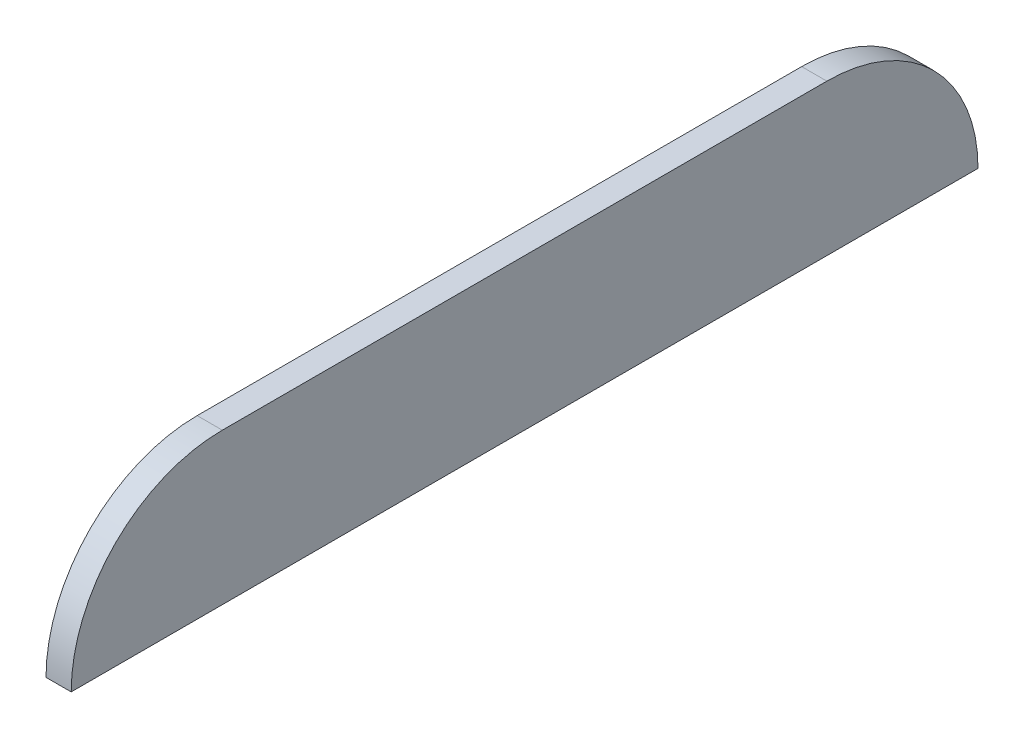
ISO-10303-21;
HEADER;
FILE_DESCRIPTION(('STEP AP214'),'2;1');
FILE_NAME('part.step','',(''),(''),'','','');
FILE_SCHEMA(('AUTOMOTIVE_DESIGN { 1 0 10303 214 1 1 1 1 }'));
ENDSEC;
DATA;
#1=APPLICATION_CONTEXT('core data for automotive mechanical design processes');
#2=APPLICATION_PROTOCOL_DEFINITION('international standard','automotive_design',2000,#1);
#3=PRODUCT_CONTEXT('',#1,'mechanical');
#4=PRODUCT('Part','Part','',(#3));
#5=PRODUCT_RELATED_PRODUCT_CATEGORY('part','',(#4));
#6=PRODUCT_DEFINITION_FORMATION('','',#4);
#7=PRODUCT_DEFINITION_CONTEXT('part definition',#1,'design');
#8=PRODUCT_DEFINITION('design','',#6,#7);
#9=PRODUCT_DEFINITION_SHAPE('','',#8);
#10=(LENGTH_UNIT() NAMED_UNIT(*) SI_UNIT(.MILLI.,.METRE.));
#11=(NAMED_UNIT(*) PLANE_ANGLE_UNIT() SI_UNIT($,.RADIAN.));
#12=(NAMED_UNIT(*) SI_UNIT($,.STERADIAN.) SOLID_ANGLE_UNIT());
#13=UNCERTAINTY_MEASURE_WITH_UNIT(LENGTH_MEASURE(1.E-05),#10,'distance_accuracy_value','');
#14=(GEOMETRIC_REPRESENTATION_CONTEXT(3) GLOBAL_UNCERTAINTY_ASSIGNED_CONTEXT((#13)) GLOBAL_UNIT_ASSIGNED_CONTEXT((#10,
#11,#12)) REPRESENTATION_CONTEXT('',''));
#15=CARTESIAN_POINT('',(0.,0.,0.));
#16=DIRECTION('',(0.,0.,1.));
#17=DIRECTION('',(1.,0.,0.));
#18=AXIS2_PLACEMENT_3D('',#15,#16,#17);
#19=CARTESIAN_POINT('',(3.175,-9.525,57.15));
#20=DIRECTION('',(0.,1.,0.));
#21=DIRECTION('',(0.,0.,1.));
#22=AXIS2_PLACEMENT_3D('',#19,#20,#21);
#23=PLANE('',#22);
#24=DIRECTION('',(0.,0.,-1.));
#25=VECTOR('',#24,1.);
#26=CARTESIAN_POINT('',(0.,-9.525,57.15));
#27=LINE('',#26,#25);
#28=CARTESIAN_POINT('',(0.,-9.525,57.15));
#29=VERTEX_POINT('',#28);
#30=CARTESIAN_POINT('',(0.,-9.52499999999998,-57.15));
#31=VERTEX_POINT('',#30);
#32=EDGE_CURVE('E101',#29,#31,#27,.T.);
#33=ORIENTED_EDGE('',*,*,#32,.T.);
#34=DIRECTION('',(-1.,0.,0.));
#35=VECTOR('',#34,1.);
#36=CARTESIAN_POINT('',(3.175,-9.52499999999998,-57.15));
#37=LINE('',#36,#35);
#38=CARTESIAN_POINT('',(3.175,-9.52499999999998,-57.15));
#39=VERTEX_POINT('',#38);
#40=EDGE_CURVE('E84',#39,#31,#37,.T.);
#41=ORIENTED_EDGE('',*,*,#40,.F.);
#42=DIRECTION('',(0.,0.,-1.));
#43=VECTOR('',#42,1.);
#44=CARTESIAN_POINT('',(3.175,-9.525,57.15));
#45=LINE('',#44,#43);
#46=CARTESIAN_POINT('',(3.175,-9.525,57.15));
#47=VERTEX_POINT('',#46);
#48=EDGE_CURVE('E73',#47,#39,#45,.T.);
#49=ORIENTED_EDGE('',*,*,#48,.F.);
#50=DIRECTION('',(-1.,0.,0.));
#51=VECTOR('',#50,1.);
#52=CARTESIAN_POINT('',(3.175,-9.525,57.15));
#53=LINE('',#52,#51);
#54=EDGE_CURVE('E82',#47,#29,#53,.T.);
#55=ORIENTED_EDGE('',*,*,#54,.T.);
#56=EDGE_LOOP('',(#33,#41,#49,#55));
#57=FACE_BOUND('',#56,.T.);
#58=ADVANCED_FACE('F33',(#57),#23,.F.);
#59=CARTESIAN_POINT('',(3.175,9.52499999999999,57.15));
#60=DIRECTION('',(0.,-1.,0.));
#61=DIRECTION('',(0.,0.,-1.));
#62=AXIS2_PLACEMENT_3D('',#59,#60,#61);
#63=PLANE('',#62);
#64=DIRECTION('',(0.,0.,1.));
#65=VECTOR('',#64,1.);
#66=CARTESIAN_POINT('',(3.175,9.52499999999999,57.15));
#67=LINE('',#66,#65);
#68=CARTESIAN_POINT('',(3.175,9.525,-38.1));
#69=VERTEX_POINT('',#68);
#70=CARTESIAN_POINT('',(3.175,9.52499999999999,38.1));
#71=VERTEX_POINT('',#70);
#72=EDGE_CURVE('E75',#69,#71,#67,.T.);
#73=ORIENTED_EDGE('',*,*,#72,.F.);
#74=DIRECTION('',(-1.,0.,0.));
#75=VECTOR('',#74,1.);
#76=CARTESIAN_POINT('',(3.175,9.525,-38.1));
#77=LINE('',#76,#75);
#78=CARTESIAN_POINT('',(0.,9.525,-38.1));
#79=VERTEX_POINT('',#78);
#80=EDGE_CURVE('E90',#69,#79,#77,.T.);
#81=ORIENTED_EDGE('',*,*,#80,.T.);
#82=DIRECTION('',(0.,0.,1.));
#83=VECTOR('',#82,1.);
#84=CARTESIAN_POINT('',(0.,9.52499999999999,57.15));
#85=LINE('',#84,#83);
#86=CARTESIAN_POINT('',(0.,9.52499999999999,38.1));
#87=VERTEX_POINT('',#86);
#88=EDGE_CURVE('E85',#79,#87,#85,.T.);
#89=ORIENTED_EDGE('',*,*,#88,.T.);
#90=DIRECTION('',(-1.,0.,0.));
#91=VECTOR('',#90,1.);
#92=CARTESIAN_POINT('',(3.175,9.52499999999999,38.1));
#93=LINE('',#92,#91);
#94=EDGE_CURVE('E48',#87,#71,#93,.F.);
#95=ORIENTED_EDGE('',*,*,#94,.T.);
#96=EDGE_LOOP('',(#73,#81,#89,#95));
#97=FACE_BOUND('',#96,.T.);
#98=ADVANCED_FACE('F106',(#97),#63,.F.);
#99=CARTESIAN_POINT('',(3.175,0.,0.));
#100=DIRECTION('',(1.,0.,0.));
#101=DIRECTION('',(0.,0.,-1.));
#102=AXIS2_PLACEMENT_3D('',#99,#100,#101);
#103=PLANE('',#102);
#104=ORIENTED_EDGE('',*,*,#48,.T.);
#105=CARTESIAN_POINT('',(3.175,-9.525,-38.1));
#106=DIRECTION('',(1.,0.,0.));
#107=DIRECTION('',(0.,0.,-1.));
#108=AXIS2_PLACEMENT_3D('',#105,#106,#107);
#109=CIRCLE('',#108,19.05);
#110=EDGE_CURVE('E11',#39,#69,#109,.T.);
#111=ORIENTED_EDGE('',*,*,#110,.T.);
#112=ORIENTED_EDGE('',*,*,#72,.T.);
#113=CARTESIAN_POINT('',(3.175,-9.52500000000001,38.1));
#114=DIRECTION('',(1.,0.,0.));
#115=DIRECTION('',(0.,0.,-1.));
#116=AXIS2_PLACEMENT_3D('',#113,#114,#115);
#117=CIRCLE('',#116,19.05);
#118=EDGE_CURVE('E41',#71,#47,#117,.T.);
#119=ORIENTED_EDGE('',*,*,#118,.T.);
#120=EDGE_LOOP('',(#104,#111,#112,#119));
#121=FACE_BOUND('',#120,.T.);
#122=ADVANCED_FACE('F72',(#121),#103,.T.);
#123=CARTESIAN_POINT('',(0.,0.,0.));
#124=DIRECTION('',(1.,0.,0.));
#125=DIRECTION('',(0.,0.,-1.));
#126=AXIS2_PLACEMENT_3D('',#123,#124,#125);
#127=PLANE('',#126);
#128=ORIENTED_EDGE('',*,*,#88,.F.);
#129=CARTESIAN_POINT('',(0.,-9.525,-38.1));
#130=DIRECTION('',(1.,0.,0.));
#131=DIRECTION('',(0.,0.,-1.));
#132=AXIS2_PLACEMENT_3D('',#129,#130,#131);
#133=CIRCLE('',#132,19.05);
#134=EDGE_CURVE('E78',#79,#31,#133,.F.);
#135=ORIENTED_EDGE('',*,*,#134,.T.);
#136=ORIENTED_EDGE('',*,*,#32,.F.);
#137=CARTESIAN_POINT('',(0.,-9.52500000000001,38.1));
#138=DIRECTION('',(1.,0.,0.));
#139=DIRECTION('',(0.,0.,-1.));
#140=AXIS2_PLACEMENT_3D('',#137,#138,#139);
#141=CIRCLE('',#140,19.05);
#142=EDGE_CURVE('E87',#29,#87,#141,.F.);
#143=ORIENTED_EDGE('',*,*,#142,.T.);
#144=EDGE_LOOP('',(#128,#135,#136,#143));
#145=FACE_BOUND('',#144,.T.);
#146=ADVANCED_FACE('F100',(#145),#127,.F.);
#147=CARTESIAN_POINT('',(3.175,-9.525,-38.1));
#148=DIRECTION('',(-1.,0.,0.));
#149=DIRECTION('',(0.,0.,1.));
#150=AXIS2_PLACEMENT_3D('',#147,#148,#149);
#151=CYLINDRICAL_SURFACE('',#150,19.05);
#152=ORIENTED_EDGE('',*,*,#110,.F.);
#153=ORIENTED_EDGE('',*,*,#40,.T.);
#154=ORIENTED_EDGE('',*,*,#134,.F.);
#155=ORIENTED_EDGE('',*,*,#80,.F.);
#156=EDGE_LOOP('',(#152,#153,#154,#155));
#157=FACE_BOUND('',#156,.T.);
#158=ADVANCED_FACE('F105',(#157),#151,.T.);
#159=CARTESIAN_POINT('',(3.175,-9.52500000000001,38.1));
#160=DIRECTION('',(-1.,0.,0.));
#161=DIRECTION('',(0.,0.,1.));
#162=AXIS2_PLACEMENT_3D('',#159,#160,#161);
#163=CYLINDRICAL_SURFACE('',#162,19.05);
#164=ORIENTED_EDGE('',*,*,#118,.F.);
#165=ORIENTED_EDGE('',*,*,#94,.F.);
#166=ORIENTED_EDGE('',*,*,#142,.F.);
#167=ORIENTED_EDGE('',*,*,#54,.F.);
#168=EDGE_LOOP('',(#164,#165,#166,#167));
#169=FACE_BOUND('',#168,.T.);
#170=ADVANCED_FACE('F35',(#169),#163,.T.);
#171=CLOSED_SHELL('',(#58,#98,#122,#146,#158,#170));
#172=MANIFOLD_SOLID_BREP('B2',#171);
#173=ADVANCED_BREP_SHAPE_REPRESENTATION('',(#18,#172),#14);
#174=SHAPE_DEFINITION_REPRESENTATION(#9,#173);
ENDSEC;
END-ISO-10303-21;
